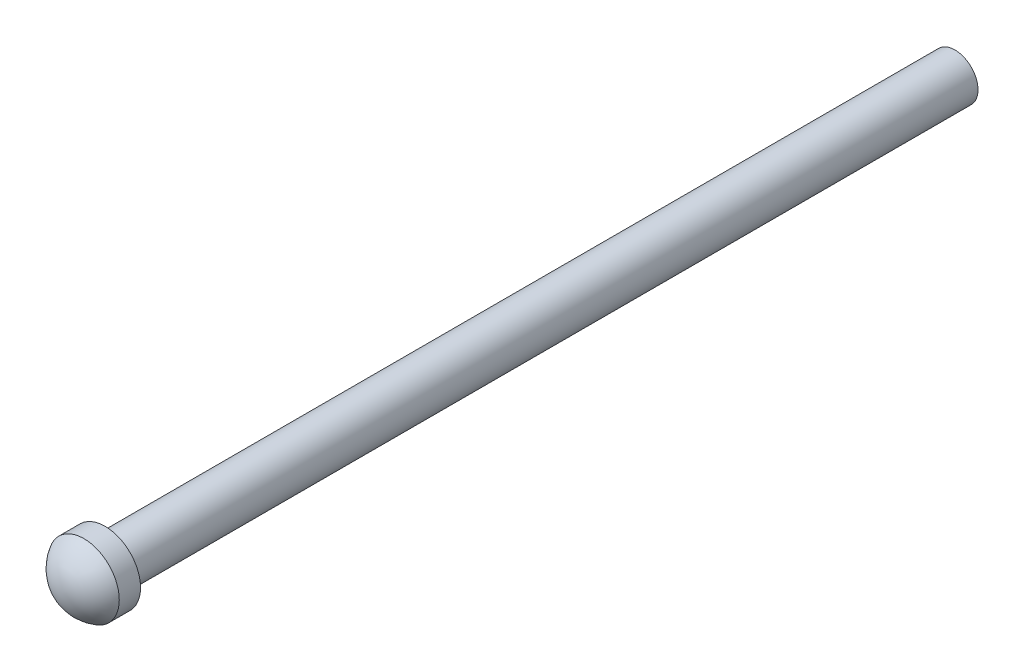
ISO-10303-21;
HEADER;
FILE_DESCRIPTION(('STEP AP214'),'2;1');
FILE_NAME('part.step','',(''),(''),'','','');
FILE_SCHEMA(('AUTOMOTIVE_DESIGN { 1 0 10303 214 1 1 1 1 }'));
ENDSEC;
DATA;
#1=APPLICATION_CONTEXT('core data for automotive mechanical design processes');
#2=APPLICATION_PROTOCOL_DEFINITION('international standard','automotive_design',2000,#1);
#3=PRODUCT_CONTEXT('',#1,'mechanical');
#4=PRODUCT('Part','Part','',(#3));
#5=PRODUCT_RELATED_PRODUCT_CATEGORY('part','',(#4));
#6=PRODUCT_DEFINITION_FORMATION('','',#4);
#7=PRODUCT_DEFINITION_CONTEXT('part definition',#1,'design');
#8=PRODUCT_DEFINITION('design','',#6,#7);
#9=PRODUCT_DEFINITION_SHAPE('','',#8);
#10=(LENGTH_UNIT() NAMED_UNIT(*) SI_UNIT(.MILLI.,.METRE.));
#11=(NAMED_UNIT(*) PLANE_ANGLE_UNIT() SI_UNIT($,.RADIAN.));
#12=(NAMED_UNIT(*) SI_UNIT($,.STERADIAN.) SOLID_ANGLE_UNIT());
#13=UNCERTAINTY_MEASURE_WITH_UNIT(LENGTH_MEASURE(1.E-05),#10,'distance_accuracy_value','');
#14=(GEOMETRIC_REPRESENTATION_CONTEXT(3) GLOBAL_UNCERTAINTY_ASSIGNED_CONTEXT((#13)) GLOBAL_UNIT_ASSIGNED_CONTEXT((#10,
#11,#12)) REPRESENTATION_CONTEXT('',''));
#15=CARTESIAN_POINT('',(0.,0.,0.));
#16=DIRECTION('',(0.,0.,1.));
#17=DIRECTION('',(1.,0.,0.));
#18=AXIS2_PLACEMENT_3D('',#15,#16,#17);
#19=CARTESIAN_POINT('',(5.,60.,-120.));
#20=DIRECTION('',(0.,0.,1.));
#21=DIRECTION('',(1.,0.,0.));
#22=AXIS2_PLACEMENT_3D('',#19,#20,#21);
#23=PLANE('',#22);
#24=CARTESIAN_POINT('',(5.,60.,-120.));
#25=DIRECTION('',(0.,0.,1.));
#26=DIRECTION('',(1.,0.,0.));
#27=AXIS2_PLACEMENT_3D('',#24,#25,#26);
#28=CIRCLE('',#27,3.25);
#29=CARTESIAN_POINT('',(8.25,60.,-120.));
#30=VERTEX_POINT('',#29);
#31=EDGE_CURVE('E11',#30,#30,#28,.T.);
#32=ORIENTED_EDGE('',*,*,#31,.F.);
#33=EDGE_LOOP('',(#32));
#34=FACE_BOUND('',#33,.T.);
#35=ADVANCED_FACE('F34',(#34),#23,.F.);
#36=CARTESIAN_POINT('',(5.,60.,0.));
#37=DIRECTION('',(0.,0.,-1.));
#38=DIRECTION('',(-1.,0.,0.));
#39=AXIS2_PLACEMENT_3D('',#36,#37,#38);
#40=CYLINDRICAL_SURFACE('',#39,3.25);
#41=ORIENTED_EDGE('',*,*,#31,.T.);
#42=EDGE_LOOP('',(#41));
#43=FACE_BOUND('',#42,.T.);
#44=CARTESIAN_POINT('',(5.,60.,0.));
#45=DIRECTION('',(0.,0.,1.));
#46=DIRECTION('',(1.,0.,0.));
#47=AXIS2_PLACEMENT_3D('',#44,#45,#46);
#48=CIRCLE('',#47,3.25);
#49=CARTESIAN_POINT('',(8.25,60.,0.));
#50=VERTEX_POINT('',#49);
#51=EDGE_CURVE('E42',#50,#50,#48,.T.);
#52=ORIENTED_EDGE('',*,*,#51,.F.);
#53=EDGE_LOOP('',(#52));
#54=FACE_BOUND('',#53,.T.);
#55=ADVANCED_FACE('F45',(#43,#54),#40,.T.);
#56=CARTESIAN_POINT('',(5.,60.,3.));
#57=DIRECTION('',(0.,0.,-1.));
#58=DIRECTION('',(-1.,0.,0.));
#59=AXIS2_PLACEMENT_3D('',#56,#57,#58);
#60=CYLINDRICAL_SURFACE('',#59,5.);
#61=CARTESIAN_POINT('',(5.,60.,3.));
#62=DIRECTION('',(0.,0.,1.));
#63=DIRECTION('',(1.,0.,0.));
#64=AXIS2_PLACEMENT_3D('',#61,#62,#63);
#65=CIRCLE('',#64,5.);
#66=CARTESIAN_POINT('',(10.,60.,3.));
#67=VERTEX_POINT('',#66);
#68=EDGE_CURVE('E38',#67,#67,#65,.T.);
#69=ORIENTED_EDGE('',*,*,#68,.F.);
#70=EDGE_LOOP('',(#69));
#71=FACE_BOUND('',#70,.T.);
#72=CARTESIAN_POINT('',(5.,60.,0.));
#73=DIRECTION('',(0.,0.,1.));
#74=DIRECTION('',(1.,0.,0.));
#75=AXIS2_PLACEMENT_3D('',#72,#73,#74);
#76=CIRCLE('',#75,5.);
#77=CARTESIAN_POINT('',(10.,60.,0.));
#78=VERTEX_POINT('',#77);
#79=EDGE_CURVE('E74',#78,#78,#76,.T.);
#80=ORIENTED_EDGE('',*,*,#79,.T.);
#81=EDGE_LOOP('',(#80));
#82=FACE_BOUND('',#81,.T.);
#83=ADVANCED_FACE('F49',(#71,#82),#60,.T.);
#84=CARTESIAN_POINT('',(5.,60.,0.333333333333336));
#85=DIRECTION('',(0.,0.,1.));
#86=DIRECTION('',(1.,0.,0.));
#87=AXIS2_PLACEMENT_3D('',#84,#85,#86);
#88=SPHERICAL_SURFACE('',#87,5.66666666666666);
#89=ORIENTED_EDGE('',*,*,#68,.T.);
#90=EDGE_LOOP('',(#89));
#91=FACE_BOUND('',#90,.T.);
#92=ADVANCED_FACE('F36',(#91),#88,.T.);
#93=CARTESIAN_POINT('',(5.,60.,0.));
#94=DIRECTION('',(0.,0.,1.));
#95=DIRECTION('',(1.,0.,0.));
#96=AXIS2_PLACEMENT_3D('',#93,#94,#95);
#97=PLANE('',#96);
#98=ORIENTED_EDGE('',*,*,#51,.T.);
#99=EDGE_LOOP('',(#98));
#100=FACE_BOUND('',#99,.T.);
#101=ORIENTED_EDGE('',*,*,#79,.F.);
#102=EDGE_LOOP('',(#101));
#103=FACE_BOUND('',#102,.T.);
#104=ADVANCED_FACE('F60',(#100,#103),#97,.F.);
#105=CLOSED_SHELL('',(#35,#55,#83,#92,#104));
#106=MANIFOLD_SOLID_BREP('B2',#105);
#107=ADVANCED_BREP_SHAPE_REPRESENTATION('',(#18,#106),#14);
#108=SHAPE_DEFINITION_REPRESENTATION(#9,#107);
ENDSEC;
END-ISO-10303-21;
